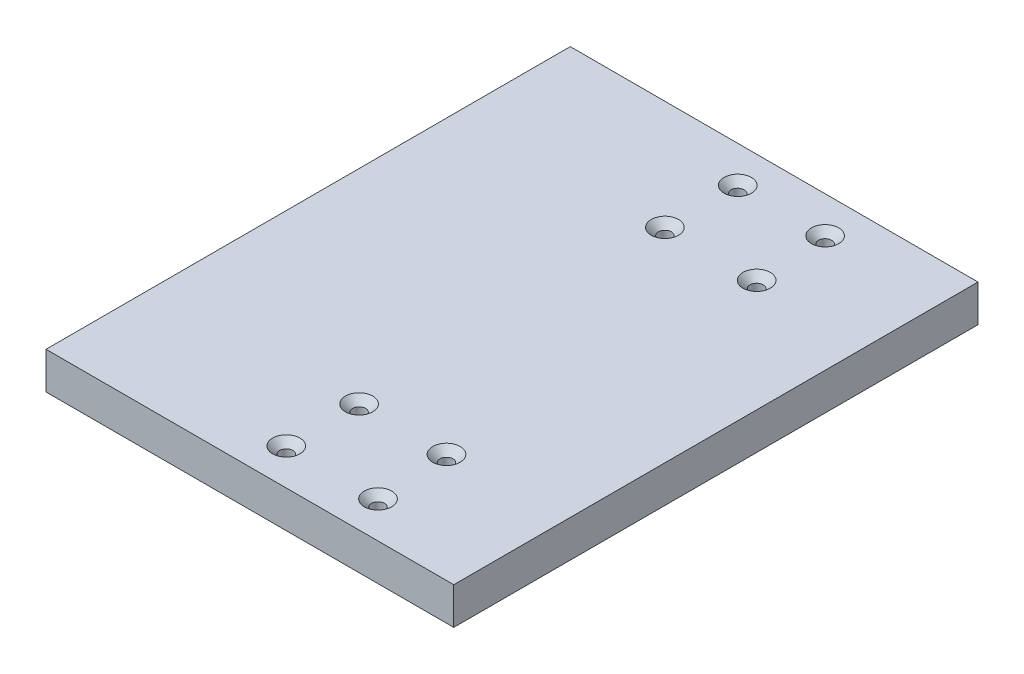
ISO-10303-21;
HEADER;
FILE_DESCRIPTION(('STEP AP214'),'2;1');
FILE_NAME('part.step','',(''),(''),'','','');
FILE_SCHEMA(('AUTOMOTIVE_DESIGN { 1 0 10303 214 1 1 1 1 }'));
ENDSEC;
DATA;
#1=APPLICATION_CONTEXT('core data for automotive mechanical design processes');
#2=APPLICATION_PROTOCOL_DEFINITION('international standard','automotive_design',2000,#1);
#3=PRODUCT_CONTEXT('',#1,'mechanical');
#4=PRODUCT('Part','Part','',(#3));
#5=PRODUCT_RELATED_PRODUCT_CATEGORY('part','',(#4));
#6=PRODUCT_DEFINITION_FORMATION('','',#4);
#7=PRODUCT_DEFINITION_CONTEXT('part definition',#1,'design');
#8=PRODUCT_DEFINITION('design','',#6,#7);
#9=PRODUCT_DEFINITION_SHAPE('','',#8);
#10=(LENGTH_UNIT() NAMED_UNIT(*) SI_UNIT(.MILLI.,.METRE.));
#11=(NAMED_UNIT(*) PLANE_ANGLE_UNIT() SI_UNIT($,.RADIAN.));
#12=(NAMED_UNIT(*) SI_UNIT($,.STERADIAN.) SOLID_ANGLE_UNIT());
#13=UNCERTAINTY_MEASURE_WITH_UNIT(LENGTH_MEASURE(1.E-05),#10,'distance_accuracy_value','');
#14=(GEOMETRIC_REPRESENTATION_CONTEXT(3) GLOBAL_UNCERTAINTY_ASSIGNED_CONTEXT((#13)) GLOBAL_UNIT_ASSIGNED_CONTEXT((#10,
#11,#12)) REPRESENTATION_CONTEXT('',''));
#15=CARTESIAN_POINT('',(0.,0.,0.));
#16=DIRECTION('',(0.,0.,1.));
#17=DIRECTION('',(1.,0.,0.));
#18=AXIS2_PLACEMENT_3D('',#15,#16,#17);
#19=CARTESIAN_POINT('',(0.,12.7,0.));
#20=DIRECTION('',(0.,-1.,0.));
#21=DIRECTION('',(0.,0.,-1.));
#22=AXIS2_PLACEMENT_3D('',#19,#20,#21);
#23=PLANE('',#22);
#24=CARTESIAN_POINT('',(0.,12.7,52.5));
#25=DIRECTION('',(0.,1.,0.));
#26=DIRECTION('',(0.,0.,1.));
#27=AXIS2_PLACEMENT_3D('',#24,#25,#26);
#28=CIRCLE('',#27,4.7);
#29=CARTESIAN_POINT('',(0.,12.7,57.2));
#30=VERTEX_POINT('',#29);
#31=EDGE_CURVE('E230',#30,#30,#28,.T.);
#32=ORIENTED_EDGE('',*,*,#31,.F.);
#33=EDGE_LOOP('',(#32));
#34=FACE_BOUND('',#33,.T.);
#35=CARTESIAN_POINT('',(30.,12.7,52.5));
#36=DIRECTION('',(0.,1.,0.));
#37=DIRECTION('',(0.,0.,1.));
#38=AXIS2_PLACEMENT_3D('',#35,#36,#37);
#39=CIRCLE('',#38,4.7);
#40=CARTESIAN_POINT('',(30.,12.7,57.2));
#41=VERTEX_POINT('',#40);
#42=EDGE_CURVE('E214',#41,#41,#39,.T.);
#43=ORIENTED_EDGE('',*,*,#42,.F.);
#44=EDGE_LOOP('',(#43));
#45=FACE_BOUND('',#44,.T.);
#46=CARTESIAN_POINT('',(31.4876777624666,12.7,77.5));
#47=DIRECTION('',(0.,1.,0.));
#48=DIRECTION('',(0.,0.,1.));
#49=AXIS2_PLACEMENT_3D('',#46,#47,#48);
#50=CIRCLE('',#49,4.7);
#51=CARTESIAN_POINT('',(31.4876777624666,12.7,82.2));
#52=VERTEX_POINT('',#51);
#53=EDGE_CURVE('E201',#52,#52,#50,.T.);
#54=ORIENTED_EDGE('',*,*,#53,.F.);
#55=EDGE_LOOP('',(#54));
#56=FACE_BOUND('',#55,.T.);
#57=CARTESIAN_POINT('',(0.,12.7,77.5));
#58=DIRECTION('',(0.,1.,0.));
#59=DIRECTION('',(0.,0.,1.));
#60=AXIS2_PLACEMENT_3D('',#57,#58,#59);
#61=CIRCLE('',#60,4.7);
#62=CARTESIAN_POINT('',(0.,12.7,82.2));
#63=VERTEX_POINT('',#62);
#64=EDGE_CURVE('E193',#63,#63,#61,.T.);
#65=ORIENTED_EDGE('',*,*,#64,.F.);
#66=EDGE_LOOP('',(#65));
#67=FACE_BOUND('',#66,.T.);
#68=CARTESIAN_POINT('',(30.,12.7,-77.5));
#69=DIRECTION('',(0.,1.,0.));
#70=DIRECTION('',(0.,0.,1.));
#71=AXIS2_PLACEMENT_3D('',#68,#69,#70);
#72=CIRCLE('',#71,4.7);
#73=CARTESIAN_POINT('',(30.,12.7,-72.8));
#74=VERTEX_POINT('',#73);
#75=EDGE_CURVE('E170',#74,#74,#72,.T.);
#76=ORIENTED_EDGE('',*,*,#75,.F.);
#77=EDGE_LOOP('',(#76));
#78=FACE_BOUND('',#77,.T.);
#79=CARTESIAN_POINT('',(31.4876777624665,12.7,-52.5));
#80=DIRECTION('',(0.,1.,0.));
#81=DIRECTION('',(0.,0.,1.));
#82=AXIS2_PLACEMENT_3D('',#79,#80,#81);
#83=CIRCLE('',#82,4.7);
#84=CARTESIAN_POINT('',(31.4876777624665,12.7,-47.8));
#85=VERTEX_POINT('',#84);
#86=EDGE_CURVE('E154',#85,#85,#83,.T.);
#87=ORIENTED_EDGE('',*,*,#86,.F.);
#88=EDGE_LOOP('',(#87));
#89=FACE_BOUND('',#88,.T.);
#90=CARTESIAN_POINT('',(0.,12.7,-52.5));
#91=DIRECTION('',(0.,1.,0.));
#92=DIRECTION('',(0.,0.,1.));
#93=AXIS2_PLACEMENT_3D('',#90,#91,#92);
#94=CIRCLE('',#93,4.7);
#95=CARTESIAN_POINT('',(0.,12.7,-47.8));
#96=VERTEX_POINT('',#95);
#97=EDGE_CURVE('E141',#96,#96,#94,.T.);
#98=ORIENTED_EDGE('',*,*,#97,.F.);
#99=EDGE_LOOP('',(#98));
#100=FACE_BOUND('',#99,.T.);
#101=DIRECTION('',(0.,0.,1.));
#102=VECTOR('',#101,1.);
#103=CARTESIAN_POINT('',(-70.,12.7,-90.));
#104=LINE('',#103,#102);
#105=CARTESIAN_POINT('',(-70.,12.7,-90.));
#106=VERTEX_POINT('',#105);
#107=CARTESIAN_POINT('',(-70.,12.7,90.));
#108=VERTEX_POINT('',#107);
#109=EDGE_CURVE('E98',#106,#108,#104,.T.);
#110=ORIENTED_EDGE('',*,*,#109,.T.);
#111=DIRECTION('',(1.,0.,0.));
#112=VECTOR('',#111,1.);
#113=CARTESIAN_POINT('',(70.,12.7,90.));
#114=LINE('',#113,#112);
#115=CARTESIAN_POINT('',(70.,12.7,90.));
#116=VERTEX_POINT('',#115);
#117=EDGE_CURVE('E91',#108,#116,#114,.T.);
#118=ORIENTED_EDGE('',*,*,#117,.T.);
#119=DIRECTION('',(0.,0.,-1.));
#120=VECTOR('',#119,1.);
#121=CARTESIAN_POINT('',(70.,12.7,-90.));
#122=LINE('',#121,#120);
#123=CARTESIAN_POINT('',(70.,12.7,-90.));
#124=VERTEX_POINT('',#123);
#125=EDGE_CURVE('E96',#116,#124,#122,.T.);
#126=ORIENTED_EDGE('',*,*,#125,.T.);
#127=DIRECTION('',(-1.,0.,0.));
#128=VECTOR('',#127,1.);
#129=CARTESIAN_POINT('',(70.,12.7,-90.));
#130=LINE('',#129,#128);
#131=EDGE_CURVE('E64',#124,#106,#130,.T.);
#132=ORIENTED_EDGE('',*,*,#131,.T.);
#133=EDGE_LOOP('',(#110,#118,#126,#132));
#134=FACE_BOUND('',#133,.T.);
#135=CARTESIAN_POINT('',(0.,12.7,-77.5));
#136=DIRECTION('',(0.,1.,0.));
#137=DIRECTION('',(0.,0.,1.));
#138=AXIS2_PLACEMENT_3D('',#135,#136,#137);
#139=CIRCLE('',#138,4.7);
#140=CARTESIAN_POINT('',(0.,12.7,-72.8));
#141=VERTEX_POINT('',#140);
#142=EDGE_CURVE('E179',#141,#141,#139,.T.);
#143=ORIENTED_EDGE('',*,*,#142,.F.);
#144=EDGE_LOOP('',(#143));
#145=FACE_BOUND('',#144,.T.);
#146=ADVANCED_FACE('F44',(#34,#45,#56,#67,#78,#89,#100,#134,#145),#23,.F.);
#147=CARTESIAN_POINT('',(0.,0.,0.));
#148=DIRECTION('',(0.,-1.,0.));
#149=DIRECTION('',(0.,0.,-1.));
#150=AXIS2_PLACEMENT_3D('',#147,#148,#149);
#151=PLANE('',#150);
#152=CARTESIAN_POINT('',(0.,0.,52.5));
#153=DIRECTION('',(0.,1.,0.));
#154=DIRECTION('',(0.,0.,1.));
#155=AXIS2_PLACEMENT_3D('',#152,#153,#154);
#156=CIRCLE('',#155,2.25);
#157=CARTESIAN_POINT('',(0.,0.,54.75));
#158=VERTEX_POINT('',#157);
#159=EDGE_CURVE('E218',#158,#158,#156,.T.);
#160=ORIENTED_EDGE('',*,*,#159,.T.);
#161=EDGE_LOOP('',(#160));
#162=FACE_BOUND('',#161,.T.);
#163=CARTESIAN_POINT('',(30.,0.,52.5));
#164=DIRECTION('',(0.,1.,0.));
#165=DIRECTION('',(0.,0.,1.));
#166=AXIS2_PLACEMENT_3D('',#163,#164,#165);
#167=CIRCLE('',#166,2.25);
#168=CARTESIAN_POINT('',(30.,0.,54.75));
#169=VERTEX_POINT('',#168);
#170=EDGE_CURVE('E210',#169,#169,#167,.T.);
#171=ORIENTED_EDGE('',*,*,#170,.T.);
#172=EDGE_LOOP('',(#171));
#173=FACE_BOUND('',#172,.T.);
#174=CARTESIAN_POINT('',(31.4876777624666,0.,77.5));
#175=DIRECTION('',(0.,1.,0.));
#176=DIRECTION('',(0.,0.,1.));
#177=AXIS2_PLACEMENT_3D('',#174,#175,#176);
#178=CIRCLE('',#177,2.25);
#179=CARTESIAN_POINT('',(31.4876777624666,0.,79.75));
#180=VERTEX_POINT('',#179);
#181=EDGE_CURVE('E192',#180,#180,#178,.T.);
#182=ORIENTED_EDGE('',*,*,#181,.T.);
#183=EDGE_LOOP('',(#182));
#184=FACE_BOUND('',#183,.T.);
#185=CARTESIAN_POINT('',(0.,0.,77.5));
#186=DIRECTION('',(0.,1.,0.));
#187=DIRECTION('',(0.,0.,1.));
#188=AXIS2_PLACEMENT_3D('',#185,#186,#187);
#189=CIRCLE('',#188,2.25);
#190=CARTESIAN_POINT('',(0.,0.,79.75));
#191=VERTEX_POINT('',#190);
#192=EDGE_CURVE('E181',#191,#191,#189,.T.);
#193=ORIENTED_EDGE('',*,*,#192,.T.);
#194=EDGE_LOOP('',(#193));
#195=FACE_BOUND('',#194,.T.);
#196=CARTESIAN_POINT('',(0.,0.,-77.5));
#197=DIRECTION('',(0.,1.,0.));
#198=DIRECTION('',(0.,0.,1.));
#199=AXIS2_PLACEMENT_3D('',#196,#197,#198);
#200=CIRCLE('',#199,2.25);
#201=CARTESIAN_POINT('',(0.,0.,-75.25));
#202=VERTEX_POINT('',#201);
#203=EDGE_CURVE('E172',#202,#202,#200,.T.);
#204=ORIENTED_EDGE('',*,*,#203,.T.);
#205=EDGE_LOOP('',(#204));
#206=FACE_BOUND('',#205,.T.);
#207=DIRECTION('',(0.,0.,1.));
#208=VECTOR('',#207,1.);
#209=CARTESIAN_POINT('',(-70.,0.,-90.));
#210=LINE('',#209,#208);
#211=CARTESIAN_POINT('',(-70.,0.,-90.));
#212=VERTEX_POINT('',#211);
#213=CARTESIAN_POINT('',(-70.,0.,90.));
#214=VERTEX_POINT('',#213);
#215=EDGE_CURVE('E111',#212,#214,#210,.T.);
#216=ORIENTED_EDGE('',*,*,#215,.F.);
#217=DIRECTION('',(-1.,0.,0.));
#218=VECTOR('',#217,1.);
#219=CARTESIAN_POINT('',(70.,0.,-90.));
#220=LINE('',#219,#218);
#221=CARTESIAN_POINT('',(70.,0.,-90.));
#222=VERTEX_POINT('',#221);
#223=EDGE_CURVE('E88',#222,#212,#220,.T.);
#224=ORIENTED_EDGE('',*,*,#223,.F.);
#225=DIRECTION('',(0.,0.,-1.));
#226=VECTOR('',#225,1.);
#227=CARTESIAN_POINT('',(70.,0.,-90.));
#228=LINE('',#227,#226);
#229=CARTESIAN_POINT('',(70.,0.,90.));
#230=VERTEX_POINT('',#229);
#231=EDGE_CURVE('E78',#230,#222,#228,.T.);
#232=ORIENTED_EDGE('',*,*,#231,.F.);
#233=DIRECTION('',(1.,0.,0.));
#234=VECTOR('',#233,1.);
#235=CARTESIAN_POINT('',(70.,0.,90.));
#236=LINE('',#235,#234);
#237=EDGE_CURVE('E103',#214,#230,#236,.T.);
#238=ORIENTED_EDGE('',*,*,#237,.F.);
#239=EDGE_LOOP('',(#216,#224,#232,#238));
#240=FACE_BOUND('',#239,.T.);
#241=CARTESIAN_POINT('',(0.,0.,-52.5));
#242=DIRECTION('',(0.,1.,0.));
#243=DIRECTION('',(0.,0.,1.));
#244=AXIS2_PLACEMENT_3D('',#241,#242,#243);
#245=CIRCLE('',#244,2.25);
#246=CARTESIAN_POINT('',(0.,0.,-50.25));
#247=VERTEX_POINT('',#246);
#248=EDGE_CURVE('E119',#247,#247,#245,.T.);
#249=ORIENTED_EDGE('',*,*,#248,.T.);
#250=EDGE_LOOP('',(#249));
#251=FACE_BOUND('',#250,.T.);
#252=CARTESIAN_POINT('',(31.4876777624665,0.,-52.5));
#253=DIRECTION('',(0.,1.,0.));
#254=DIRECTION('',(0.,0.,1.));
#255=AXIS2_PLACEMENT_3D('',#252,#253,#254);
#256=CIRCLE('',#255,2.25);
#257=CARTESIAN_POINT('',(31.4876777624665,0.,-50.25));
#258=VERTEX_POINT('',#257);
#259=EDGE_CURVE('E150',#258,#258,#256,.T.);
#260=ORIENTED_EDGE('',*,*,#259,.T.);
#261=EDGE_LOOP('',(#260));
#262=FACE_BOUND('',#261,.T.);
#263=CARTESIAN_POINT('',(30.,0.,-77.5));
#264=DIRECTION('',(0.,1.,0.));
#265=DIRECTION('',(0.,0.,1.));
#266=AXIS2_PLACEMENT_3D('',#263,#264,#265);
#267=CIRCLE('',#266,2.25);
#268=CARTESIAN_POINT('',(30.,0.,-75.25));
#269=VERTEX_POINT('',#268);
#270=EDGE_CURVE('E157',#269,#269,#267,.T.);
#271=ORIENTED_EDGE('',*,*,#270,.T.);
#272=EDGE_LOOP('',(#271));
#273=FACE_BOUND('',#272,.T.);
#274=ADVANCED_FACE('F132',(#162,#173,#184,#195,#206,#240,#251,#262,#273),#151,.T.);
#275=CARTESIAN_POINT('',(-70.,12.7,-90.));
#276=DIRECTION('',(1.,0.,0.));
#277=DIRECTION('',(0.,0.,-1.));
#278=AXIS2_PLACEMENT_3D('',#275,#276,#277);
#279=PLANE('',#278);
#280=ORIENTED_EDGE('',*,*,#215,.T.);
#281=DIRECTION('',(0.,-1.,0.));
#282=VECTOR('',#281,1.);
#283=CARTESIAN_POINT('',(-70.,12.7,90.));
#284=LINE('',#283,#282);
#285=EDGE_CURVE('E11',#108,#214,#284,.T.);
#286=ORIENTED_EDGE('',*,*,#285,.F.);
#287=ORIENTED_EDGE('',*,*,#109,.F.);
#288=DIRECTION('',(0.,-1.,0.));
#289=VECTOR('',#288,1.);
#290=CARTESIAN_POINT('',(-70.,12.7,-90.));
#291=LINE('',#290,#289);
#292=EDGE_CURVE('E109',#106,#212,#291,.T.);
#293=ORIENTED_EDGE('',*,*,#292,.T.);
#294=EDGE_LOOP('',(#280,#286,#287,#293));
#295=FACE_BOUND('',#294,.T.);
#296=ADVANCED_FACE('F50',(#295),#279,.F.);
#297=CARTESIAN_POINT('',(70.,12.7,90.));
#298=DIRECTION('',(0.,0.,-1.));
#299=DIRECTION('',(-1.,0.,0.));
#300=AXIS2_PLACEMENT_3D('',#297,#298,#299);
#301=PLANE('',#300);
#302=ORIENTED_EDGE('',*,*,#237,.T.);
#303=DIRECTION('',(0.,-1.,0.));
#304=VECTOR('',#303,1.);
#305=CARTESIAN_POINT('',(70.,12.7,90.));
#306=LINE('',#305,#304);
#307=EDGE_CURVE('E54',#116,#230,#306,.T.);
#308=ORIENTED_EDGE('',*,*,#307,.F.);
#309=ORIENTED_EDGE('',*,*,#117,.F.);
#310=ORIENTED_EDGE('',*,*,#285,.T.);
#311=EDGE_LOOP('',(#302,#308,#309,#310));
#312=FACE_BOUND('',#311,.T.);
#313=ADVANCED_FACE('F105',(#312),#301,.F.);
#314=CARTESIAN_POINT('',(70.,12.7,-90.));
#315=DIRECTION('',(-1.,0.,0.));
#316=DIRECTION('',(0.,0.,1.));
#317=AXIS2_PLACEMENT_3D('',#314,#315,#316);
#318=PLANE('',#317);
#319=ORIENTED_EDGE('',*,*,#231,.T.);
#320=DIRECTION('',(0.,-1.,0.));
#321=VECTOR('',#320,1.);
#322=CARTESIAN_POINT('',(70.,12.7,-90.));
#323=LINE('',#322,#321);
#324=EDGE_CURVE('E104',#124,#222,#323,.T.);
#325=ORIENTED_EDGE('',*,*,#324,.F.);
#326=ORIENTED_EDGE('',*,*,#125,.F.);
#327=ORIENTED_EDGE('',*,*,#307,.T.);
#328=EDGE_LOOP('',(#319,#325,#326,#327));
#329=FACE_BOUND('',#328,.T.);
#330=ADVANCED_FACE('F106',(#329),#318,.F.);
#331=CARTESIAN_POINT('',(70.,12.7,-90.));
#332=DIRECTION('',(0.,0.,1.));
#333=DIRECTION('',(1.,0.,0.));
#334=AXIS2_PLACEMENT_3D('',#331,#332,#333);
#335=PLANE('',#334);
#336=ORIENTED_EDGE('',*,*,#223,.T.);
#337=ORIENTED_EDGE('',*,*,#292,.F.);
#338=ORIENTED_EDGE('',*,*,#131,.F.);
#339=ORIENTED_EDGE('',*,*,#324,.T.);
#340=EDGE_LOOP('',(#336,#337,#338,#339));
#341=FACE_BOUND('',#340,.T.);
#342=ADVANCED_FACE('F126',(#341),#335,.F.);
#343=CARTESIAN_POINT('',(0.,12.7,-52.5));
#344=DIRECTION('',(0.,1.,0.));
#345=DIRECTION('',(0.,0.,1.));
#346=AXIS2_PLACEMENT_3D('',#343,#344,#345);
#347=CYLINDRICAL_SURFACE('',#346,2.25);
#348=ORIENTED_EDGE('',*,*,#248,.F.);
#349=EDGE_LOOP('',(#348));
#350=FACE_BOUND('',#349,.T.);
#351=CARTESIAN_POINT('',(0.,10.25,-52.5));
#352=DIRECTION('',(0.,1.,0.));
#353=DIRECTION('',(0.,0.,1.));
#354=AXIS2_PLACEMENT_3D('',#351,#352,#353);
#355=CIRCLE('',#354,2.25);
#356=CARTESIAN_POINT('',(0.,10.25,-50.25));
#357=VERTEX_POINT('',#356);
#358=EDGE_CURVE('E139',#357,#357,#355,.T.);
#359=ORIENTED_EDGE('',*,*,#358,.T.);
#360=EDGE_LOOP('',(#359));
#361=FACE_BOUND('',#360,.T.);
#362=ADVANCED_FACE('F252',(#350,#361),#347,.F.);
#363=CARTESIAN_POINT('',(0.,12.7,-52.5));
#364=DIRECTION('',(0.,1.,0.));
#365=DIRECTION('',(0.,0.,1.));
#366=AXIS2_PLACEMENT_3D('',#363,#364,#365);
#367=CONICAL_SURFACE('',#366,4.7,0.785398163397448);
#368=ORIENTED_EDGE('',*,*,#358,.F.);
#369=EDGE_LOOP('',(#368));
#370=FACE_BOUND('',#369,.T.);
#371=ORIENTED_EDGE('',*,*,#97,.T.);
#372=EDGE_LOOP('',(#371));
#373=FACE_BOUND('',#372,.T.);
#374=ADVANCED_FACE('F249',(#370,#373),#367,.F.);
#375=CARTESIAN_POINT('',(31.4876777624665,12.7,-52.5));
#376=DIRECTION('',(0.,1.,0.));
#377=DIRECTION('',(0.,0.,1.));
#378=AXIS2_PLACEMENT_3D('',#375,#376,#377);
#379=CYLINDRICAL_SURFACE('',#378,2.25);
#380=ORIENTED_EDGE('',*,*,#259,.F.);
#381=EDGE_LOOP('',(#380));
#382=FACE_BOUND('',#381,.T.);
#383=CARTESIAN_POINT('',(31.4876777624665,10.25,-52.5));
#384=DIRECTION('',(0.,1.,0.));
#385=DIRECTION('',(0.,0.,1.));
#386=AXIS2_PLACEMENT_3D('',#383,#384,#385);
#387=CIRCLE('',#386,2.25);
#388=CARTESIAN_POINT('',(31.4876777624665,10.25,-50.25));
#389=VERTEX_POINT('',#388);
#390=EDGE_CURVE('E151',#389,#389,#387,.T.);
#391=ORIENTED_EDGE('',*,*,#390,.T.);
#392=EDGE_LOOP('',(#391));
#393=FACE_BOUND('',#392,.T.);
#394=ADVANCED_FACE('F253',(#382,#393),#379,.F.);
#395=CARTESIAN_POINT('',(31.4876777624665,12.7,-52.5));
#396=DIRECTION('',(0.,1.,0.));
#397=DIRECTION('',(0.,0.,1.));
#398=AXIS2_PLACEMENT_3D('',#395,#396,#397);
#399=CONICAL_SURFACE('',#398,4.7,0.785398163397449);
#400=ORIENTED_EDGE('',*,*,#390,.F.);
#401=EDGE_LOOP('',(#400));
#402=FACE_BOUND('',#401,.T.);
#403=ORIENTED_EDGE('',*,*,#86,.T.);
#404=EDGE_LOOP('',(#403));
#405=FACE_BOUND('',#404,.T.);
#406=ADVANCED_FACE('F259',(#402,#405),#399,.F.);
#407=CARTESIAN_POINT('',(30.,12.7,-77.5));
#408=DIRECTION('',(0.,1.,0.));
#409=DIRECTION('',(0.,0.,1.));
#410=AXIS2_PLACEMENT_3D('',#407,#408,#409);
#411=CYLINDRICAL_SURFACE('',#410,2.25);
#412=ORIENTED_EDGE('',*,*,#270,.F.);
#413=EDGE_LOOP('',(#412));
#414=FACE_BOUND('',#413,.T.);
#415=CARTESIAN_POINT('',(30.,10.25,-77.5));
#416=DIRECTION('',(0.,1.,0.));
#417=DIRECTION('',(0.,0.,1.));
#418=AXIS2_PLACEMENT_3D('',#415,#416,#417);
#419=CIRCLE('',#418,2.25);
#420=CARTESIAN_POINT('',(30.,10.25,-75.25));
#421=VERTEX_POINT('',#420);
#422=EDGE_CURVE('E162',#421,#421,#419,.T.);
#423=ORIENTED_EDGE('',*,*,#422,.T.);
#424=EDGE_LOOP('',(#423));
#425=FACE_BOUND('',#424,.T.);
#426=ADVANCED_FACE('F332',(#414,#425),#411,.F.);
#427=CARTESIAN_POINT('',(30.,12.7,-77.5));
#428=DIRECTION('',(0.,1.,0.));
#429=DIRECTION('',(0.,0.,1.));
#430=AXIS2_PLACEMENT_3D('',#427,#428,#429);
#431=CONICAL_SURFACE('',#430,4.7,0.785398163397448);
#432=ORIENTED_EDGE('',*,*,#422,.F.);
#433=EDGE_LOOP('',(#432));
#434=FACE_BOUND('',#433,.T.);
#435=ORIENTED_EDGE('',*,*,#75,.T.);
#436=EDGE_LOOP('',(#435));
#437=FACE_BOUND('',#436,.T.);
#438=ADVANCED_FACE('F338',(#434,#437),#431,.F.);
#439=CARTESIAN_POINT('',(0.,12.7,-77.5));
#440=DIRECTION('',(0.,1.,0.));
#441=DIRECTION('',(0.,0.,1.));
#442=AXIS2_PLACEMENT_3D('',#439,#440,#441);
#443=CYLINDRICAL_SURFACE('',#442,2.25);
#444=ORIENTED_EDGE('',*,*,#203,.F.);
#445=EDGE_LOOP('',(#444));
#446=FACE_BOUND('',#445,.T.);
#447=CARTESIAN_POINT('',(0.,10.25,-77.5));
#448=DIRECTION('',(0.,1.,0.));
#449=DIRECTION('',(0.,0.,1.));
#450=AXIS2_PLACEMENT_3D('',#447,#448,#449);
#451=CIRCLE('',#450,2.25);
#452=CARTESIAN_POINT('',(0.,10.25,-75.25));
#453=VERTEX_POINT('',#452);
#454=EDGE_CURVE('E173',#453,#453,#451,.T.);
#455=ORIENTED_EDGE('',*,*,#454,.T.);
#456=EDGE_LOOP('',(#455));
#457=FACE_BOUND('',#456,.T.);
#458=ADVANCED_FACE('F348',(#446,#457),#443,.F.);
#459=CARTESIAN_POINT('',(0.,12.7,-77.5));
#460=DIRECTION('',(0.,1.,0.));
#461=DIRECTION('',(0.,0.,1.));
#462=AXIS2_PLACEMENT_3D('',#459,#460,#461);
#463=CONICAL_SURFACE('',#462,4.7,0.785398163397448);
#464=ORIENTED_EDGE('',*,*,#454,.F.);
#465=EDGE_LOOP('',(#464));
#466=FACE_BOUND('',#465,.T.);
#467=ORIENTED_EDGE('',*,*,#142,.T.);
#468=EDGE_LOOP('',(#467));
#469=FACE_BOUND('',#468,.T.);
#470=ADVANCED_FACE('F357',(#466,#469),#463,.F.);
#471=CARTESIAN_POINT('',(0.,12.7,77.5));
#472=DIRECTION('',(0.,1.,0.));
#473=DIRECTION('',(0.,0.,1.));
#474=AXIS2_PLACEMENT_3D('',#471,#472,#473);
#475=CYLINDRICAL_SURFACE('',#474,2.25);
#476=ORIENTED_EDGE('',*,*,#192,.F.);
#477=EDGE_LOOP('',(#476));
#478=FACE_BOUND('',#477,.T.);
#479=CARTESIAN_POINT('',(0.,10.25,77.5));
#480=DIRECTION('',(0.,1.,0.));
#481=DIRECTION('',(0.,0.,1.));
#482=AXIS2_PLACEMENT_3D('',#479,#480,#481);
#483=CIRCLE('',#482,2.25);
#484=CARTESIAN_POINT('',(0.,10.25,79.75));
#485=VERTEX_POINT('',#484);
#486=EDGE_CURVE('E190',#485,#485,#483,.T.);
#487=ORIENTED_EDGE('',*,*,#486,.T.);
#488=EDGE_LOOP('',(#487));
#489=FACE_BOUND('',#488,.T.);
#490=ADVANCED_FACE('F367',(#478,#489),#475,.F.);
#491=CARTESIAN_POINT('',(0.,12.7,77.5));
#492=DIRECTION('',(0.,1.,0.));
#493=DIRECTION('',(0.,0.,1.));
#494=AXIS2_PLACEMENT_3D('',#491,#492,#493);
#495=CONICAL_SURFACE('',#494,4.7,0.785398163397448);
#496=ORIENTED_EDGE('',*,*,#486,.F.);
#497=EDGE_LOOP('',(#496));
#498=FACE_BOUND('',#497,.T.);
#499=ORIENTED_EDGE('',*,*,#64,.T.);
#500=EDGE_LOOP('',(#499));
#501=FACE_BOUND('',#500,.T.);
#502=ADVANCED_FACE('F379',(#498,#501),#495,.F.);
#503=CARTESIAN_POINT('',(31.4876777624666,12.7,77.5));
#504=DIRECTION('',(0.,1.,0.));
#505=DIRECTION('',(0.,0.,1.));
#506=AXIS2_PLACEMENT_3D('',#503,#504,#505);
#507=CYLINDRICAL_SURFACE('',#506,2.25);
#508=ORIENTED_EDGE('',*,*,#181,.F.);
#509=EDGE_LOOP('',(#508));
#510=FACE_BOUND('',#509,.T.);
#511=CARTESIAN_POINT('',(31.4876777624666,10.25,77.5));
#512=DIRECTION('',(0.,1.,0.));
#513=DIRECTION('',(0.,0.,1.));
#514=AXIS2_PLACEMENT_3D('',#511,#512,#513);
#515=CIRCLE('',#514,2.25);
#516=CARTESIAN_POINT('',(31.4876777624666,10.25,79.75));
#517=VERTEX_POINT('',#516);
#518=EDGE_CURVE('E200',#517,#517,#515,.T.);
#519=ORIENTED_EDGE('',*,*,#518,.T.);
#520=EDGE_LOOP('',(#519));
#521=FACE_BOUND('',#520,.T.);
#522=ADVANCED_FACE('F388',(#510,#521),#507,.F.);
#523=CARTESIAN_POINT('',(31.4876777624666,12.7,77.5));
#524=DIRECTION('',(0.,1.,0.));
#525=DIRECTION('',(0.,0.,1.));
#526=AXIS2_PLACEMENT_3D('',#523,#524,#525);
#527=CONICAL_SURFACE('',#526,4.7,0.785398163397448);
#528=ORIENTED_EDGE('',*,*,#518,.F.);
#529=EDGE_LOOP('',(#528));
#530=FACE_BOUND('',#529,.T.);
#531=ORIENTED_EDGE('',*,*,#53,.T.);
#532=EDGE_LOOP('',(#531));
#533=FACE_BOUND('',#532,.T.);
#534=ADVANCED_FACE('F397',(#530,#533),#527,.F.);
#535=CARTESIAN_POINT('',(30.,12.7,52.5));
#536=DIRECTION('',(0.,1.,0.));
#537=DIRECTION('',(0.,0.,1.));
#538=AXIS2_PLACEMENT_3D('',#535,#536,#537);
#539=CYLINDRICAL_SURFACE('',#538,2.25);
#540=ORIENTED_EDGE('',*,*,#170,.F.);
#541=EDGE_LOOP('',(#540));
#542=FACE_BOUND('',#541,.T.);
#543=CARTESIAN_POINT('',(30.,10.25,52.5));
#544=DIRECTION('',(0.,1.,0.));
#545=DIRECTION('',(0.,0.,1.));
#546=AXIS2_PLACEMENT_3D('',#543,#544,#545);
#547=CIRCLE('',#546,2.25);
#548=CARTESIAN_POINT('',(30.,10.25,54.75));
#549=VERTEX_POINT('',#548);
#550=EDGE_CURVE('E211',#549,#549,#547,.T.);
#551=ORIENTED_EDGE('',*,*,#550,.T.);
#552=EDGE_LOOP('',(#551));
#553=FACE_BOUND('',#552,.T.);
#554=ADVANCED_FACE('F408',(#542,#553),#539,.F.);
#555=CARTESIAN_POINT('',(30.,12.7,52.5));
#556=DIRECTION('',(0.,1.,0.));
#557=DIRECTION('',(0.,0.,1.));
#558=AXIS2_PLACEMENT_3D('',#555,#556,#557);
#559=CONICAL_SURFACE('',#558,4.7,0.785398163397449);
#560=ORIENTED_EDGE('',*,*,#550,.F.);
#561=EDGE_LOOP('',(#560));
#562=FACE_BOUND('',#561,.T.);
#563=ORIENTED_EDGE('',*,*,#42,.T.);
#564=EDGE_LOOP('',(#563));
#565=FACE_BOUND('',#564,.T.);
#566=ADVANCED_FACE('F419',(#562,#565),#559,.F.);
#567=CARTESIAN_POINT('',(0.,12.7,52.5));
#568=DIRECTION('',(0.,1.,0.));
#569=DIRECTION('',(0.,0.,1.));
#570=AXIS2_PLACEMENT_3D('',#567,#568,#569);
#571=CYLINDRICAL_SURFACE('',#570,2.25);
#572=ORIENTED_EDGE('',*,*,#159,.F.);
#573=EDGE_LOOP('',(#572));
#574=FACE_BOUND('',#573,.T.);
#575=CARTESIAN_POINT('',(0.,10.25,52.5));
#576=DIRECTION('',(0.,1.,0.));
#577=DIRECTION('',(0.,0.,1.));
#578=AXIS2_PLACEMENT_3D('',#575,#576,#577);
#579=CIRCLE('',#578,2.25);
#580=CARTESIAN_POINT('',(0.,10.25,54.75));
#581=VERTEX_POINT('',#580);
#582=EDGE_CURVE('E224',#581,#581,#579,.T.);
#583=ORIENTED_EDGE('',*,*,#582,.T.);
#584=EDGE_LOOP('',(#583));
#585=FACE_BOUND('',#584,.T.);
#586=ADVANCED_FACE('F429',(#574,#585),#571,.F.);
#587=CARTESIAN_POINT('',(0.,12.7,52.5));
#588=DIRECTION('',(0.,1.,0.));
#589=DIRECTION('',(0.,0.,1.));
#590=AXIS2_PLACEMENT_3D('',#587,#588,#589);
#591=CONICAL_SURFACE('',#590,4.7,0.785398163397448);
#592=ORIENTED_EDGE('',*,*,#582,.F.);
#593=EDGE_LOOP('',(#592));
#594=FACE_BOUND('',#593,.T.);
#595=ORIENTED_EDGE('',*,*,#31,.T.);
#596=EDGE_LOOP('',(#595));
#597=FACE_BOUND('',#596,.T.);
#598=ADVANCED_FACE('F235',(#594,#597),#591,.F.);
#599=CLOSED_SHELL('',(#146,#274,#296,#313,#330,#342,#362,#374,#394,#406,#426,#438,#458,#470,
#490,#502,#522,#534,#554,#566,#586,#598));
#600=MANIFOLD_SOLID_BREP('B2',#599);
#601=ADVANCED_BREP_SHAPE_REPRESENTATION('',(#18,#600),#14);
#602=SHAPE_DEFINITION_REPRESENTATION(#9,#601);
ENDSEC;
END-ISO-10303-21;
